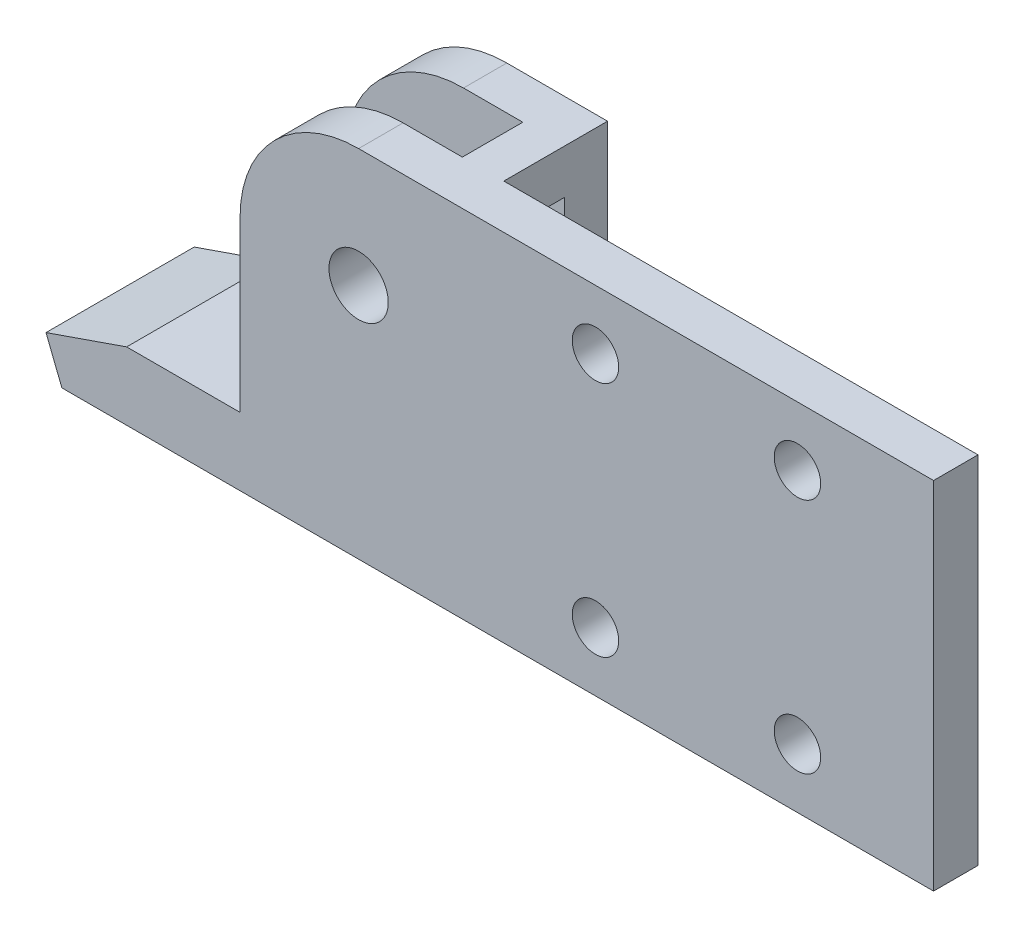
ISO-10303-21;
HEADER;
FILE_DESCRIPTION(('STEP AP214'),'2;1');
FILE_NAME('part.step','',(''),(''),'','','');
FILE_SCHEMA(('AUTOMOTIVE_DESIGN { 1 0 10303 214 1 1 1 1 }'));
ENDSEC;
DATA;
#1=APPLICATION_CONTEXT('core data for automotive mechanical design processes');
#2=APPLICATION_PROTOCOL_DEFINITION('international standard','automotive_design',2000,#1);
#3=PRODUCT_CONTEXT('',#1,'mechanical');
#4=PRODUCT('Part','Part','',(#3));
#5=PRODUCT_RELATED_PRODUCT_CATEGORY('part','',(#4));
#6=PRODUCT_DEFINITION_FORMATION('','',#4);
#7=PRODUCT_DEFINITION_CONTEXT('part definition',#1,'design');
#8=PRODUCT_DEFINITION('design','',#6,#7);
#9=PRODUCT_DEFINITION_SHAPE('','',#8);
#10=(LENGTH_UNIT() NAMED_UNIT(*) SI_UNIT(.MILLI.,.METRE.));
#11=(NAMED_UNIT(*) PLANE_ANGLE_UNIT() SI_UNIT($,.RADIAN.));
#12=(NAMED_UNIT(*) SI_UNIT($,.STERADIAN.) SOLID_ANGLE_UNIT());
#13=UNCERTAINTY_MEASURE_WITH_UNIT(LENGTH_MEASURE(1.E-05),#10,'distance_accuracy_value','');
#14=(GEOMETRIC_REPRESENTATION_CONTEXT(3) GLOBAL_UNCERTAINTY_ASSIGNED_CONTEXT((#13)) GLOBAL_UNIT_ASSIGNED_CONTEXT((#10,
#11,#12)) REPRESENTATION_CONTEXT('',''));
#15=CARTESIAN_POINT('',(0.,0.,0.));
#16=DIRECTION('',(0.,0.,1.));
#17=DIRECTION('',(1.,0.,0.));
#18=AXIS2_PLACEMENT_3D('',#15,#16,#17);
#19=CARTESIAN_POINT('',(-36.195000000001,-203.1333598559,4.7625));
#20=DIRECTION('',(0.,0.,-1.));
#21=DIRECTION('',(-1.,0.,0.));
#22=AXIS2_PLACEMENT_3D('',#19,#20,#21);
#23=CYLINDRICAL_SURFACE('',#22,12.7);
#24=CARTESIAN_POINT('',(-36.195000000001,-203.1333598559,-6.477));
#25=DIRECTION('',(0.,0.,-1.));
#26=DIRECTION('',(0.,1.,0.));
#27=AXIS2_PLACEMENT_3D('',#24,#25,#26);
#28=CIRCLE('',#27,12.7);
#29=CARTESIAN_POINT('',(-48.895000000001,-203.1333598559,-6.477));
#30=VERTEX_POINT('',#29);
#31=CARTESIAN_POINT('',(-36.195000000001,-190.4333598559,-6.477));
#32=VERTEX_POINT('',#31);
#33=EDGE_CURVE('E203',#30,#32,#28,.T.);
#34=ORIENTED_EDGE('',*,*,#33,.T.);
#35=DIRECTION('',(0.,0.,-1.));
#36=VECTOR('',#35,1.);
#37=CARTESIAN_POINT('',(-36.195000000001,-190.4333598559,4.7625));
#38=LINE('',#37,#36);
#39=CARTESIAN_POINT('',(-36.195000000001,-190.4333598559,-11.1125));
#40=VERTEX_POINT('',#39);
#41=EDGE_CURVE('E302',#32,#40,#38,.T.);
#42=ORIENTED_EDGE('',*,*,#41,.T.);
#43=CARTESIAN_POINT('',(-36.195000000001,-203.1333598559,-11.1125));
#44=DIRECTION('',(0.,0.,-1.));
#45=DIRECTION('',(-1.,0.,0.));
#46=AXIS2_PLACEMENT_3D('',#43,#44,#45);
#47=CIRCLE('',#46,12.7);
#48=CARTESIAN_POINT('',(-48.895000000001,-203.1333598559,-11.1125));
#49=VERTEX_POINT('',#48);
#50=EDGE_CURVE('E235',#49,#40,#47,.T.);
#51=ORIENTED_EDGE('',*,*,#50,.F.);
#52=DIRECTION('',(0.,0.,-1.));
#53=VECTOR('',#52,1.);
#54=CARTESIAN_POINT('',(-48.895000000001,-203.1333598559,4.7625));
#55=LINE('',#54,#53);
#56=EDGE_CURVE('E297',#30,#49,#55,.T.);
#57=ORIENTED_EDGE('',*,*,#56,.F.);
#58=EDGE_LOOP('',(#34,#42,#51,#57));
#59=FACE_BOUND('',#58,.T.);
#60=ADVANCED_FACE('F42',(#59),#23,.T.);
#61=CARTESIAN_POINT('',(-24.765000000001,-195.1958598559,0.));
#62=DIRECTION('',(0.,1.,0.));
#63=DIRECTION('',(-1.,0.,0.));
#64=AXIS2_PLACEMENT_3D('',#61,#62,#63);
#65=PLANE('',#64);
#66=DIRECTION('',(0.,0.,-1.));
#67=VECTOR('',#66,1.);
#68=CARTESIAN_POINT('',(-29.845000000001,-195.1958598559,0.));
#69=LINE('',#68,#67);
#70=CARTESIAN_POINT('',(-29.845000000001,-195.1958598559,0.));
#71=VERTEX_POINT('',#70);
#72=CARTESIAN_POINT('',(-29.845000000001,-195.1958598559,-6.477));
#73=VERTEX_POINT('',#72);
#74=EDGE_CURVE('E161',#71,#73,#69,.T.);
#75=ORIENTED_EDGE('',*,*,#74,.T.);
#76=DIRECTION('',(-1.,0.,0.));
#77=VECTOR('',#76,1.);
#78=CARTESIAN_POINT('',(-24.765000000001,-195.1958598559,-6.477));
#79=LINE('',#78,#77);
#80=CARTESIAN_POINT('',(-25.4000000000009,-195.1958598559,-6.477));
#81=VERTEX_POINT('',#80);
#82=EDGE_CURVE('E186',#81,#73,#79,.T.);
#83=ORIENTED_EDGE('',*,*,#82,.F.);
#84=DIRECTION('',(0.,0.,-1.));
#85=VECTOR('',#84,1.);
#86=CARTESIAN_POINT('',(-25.4000000000009,-195.1958598559,-11.1125));
#87=LINE('',#86,#85);
#88=CARTESIAN_POINT('',(-25.4000000000009,-195.1958598559,0.));
#89=VERTEX_POINT('',#88);
#90=EDGE_CURVE('E11',#89,#81,#87,.T.);
#91=ORIENTED_EDGE('',*,*,#90,.F.);
#92=DIRECTION('',(-1.,0.,0.));
#93=VECTOR('',#92,1.);
#94=CARTESIAN_POINT('',(-24.765000000001,-195.1958598559,0.));
#95=LINE('',#94,#93);
#96=EDGE_CURVE('E177',#89,#71,#95,.T.);
#97=ORIENTED_EDGE('',*,*,#96,.T.);
#98=EDGE_LOOP('',(#75,#83,#91,#97));
#99=FACE_BOUND('',#98,.T.);
#100=ADVANCED_FACE('F184',(#99),#65,.F.);
#101=CARTESIAN_POINT('',(-36.195000000001,-203.1333598559,0.));
#102=DIRECTION('',(0.,0.,1.));
#103=DIRECTION('',(1.,0.,0.));
#104=AXIS2_PLACEMENT_3D('',#101,#102,#103);
#105=PLANE('',#104);
#106=CARTESIAN_POINT('',(-10.8204,-196.7833598559,0.));
#107=DIRECTION('',(0.,0.,1.));
#108=DIRECTION('',(1.,0.,0.));
#109=AXIS2_PLACEMENT_3D('',#106,#107,#108);
#110=CIRCLE('',#109,2.4892);
#111=CARTESIAN_POINT('',(-8.3312,-196.7833598559,0.));
#112=VERTEX_POINT('',#111);
#113=EDGE_CURVE('E386',#112,#112,#110,.T.);
#114=ORIENTED_EDGE('',*,*,#113,.T.);
#115=EDGE_LOOP('',(#114));
#116=FACE_BOUND('',#115,.T.);
#117=CARTESIAN_POINT('',(-10.8204,-222.1833598559,0.));
#118=DIRECTION('',(0.,0.,1.));
#119=DIRECTION('',(1.,0.,0.));
#120=AXIS2_PLACEMENT_3D('',#117,#118,#119);
#121=CIRCLE('',#120,2.4892);
#122=CARTESIAN_POINT('',(-8.3312,-222.1833598559,0.));
#123=VERTEX_POINT('',#122);
#124=EDGE_CURVE('E378',#123,#123,#121,.T.);
#125=ORIENTED_EDGE('',*,*,#124,.T.);
#126=EDGE_LOOP('',(#125));
#127=FACE_BOUND('',#126,.T.);
#128=CARTESIAN_POINT('',(10.8204,-222.1833598559,0.));
#129=DIRECTION('',(0.,0.,1.));
#130=DIRECTION('',(1.,0.,0.));
#131=AXIS2_PLACEMENT_3D('',#128,#129,#130);
#132=CIRCLE('',#131,2.4892);
#133=CARTESIAN_POINT('',(13.3096,-222.1833598559,0.));
#134=VERTEX_POINT('',#133);
#135=EDGE_CURVE('E370',#134,#134,#132,.T.);
#136=ORIENTED_EDGE('',*,*,#135,.T.);
#137=EDGE_LOOP('',(#136));
#138=FACE_BOUND('',#137,.T.);
#139=CARTESIAN_POINT('',(10.8204,-196.7833598559,0.));
#140=DIRECTION('',(0.,0.,1.));
#141=DIRECTION('',(1.,0.,0.));
#142=AXIS2_PLACEMENT_3D('',#139,#140,#141);
#143=CIRCLE('',#142,2.4892);
#144=CARTESIAN_POINT('',(13.3096,-196.7833598559,0.));
#145=VERTEX_POINT('',#144);
#146=EDGE_CURVE('E362',#145,#145,#143,.T.);
#147=ORIENTED_EDGE('',*,*,#146,.T.);
#148=EDGE_LOOP('',(#147));
#149=FACE_BOUND('',#148,.T.);
#150=ORIENTED_EDGE('',*,*,#96,.F.);
#151=DIRECTION('',(0.,-1.,0.));
#152=VECTOR('',#151,1.);
#153=CARTESIAN_POINT('',(-25.4000000000009,-190.4333598559,0.));
#154=LINE('',#153,#152);
#155=CARTESIAN_POINT('',(-25.4000000000009,-190.4333598559,0.));
#156=VERTEX_POINT('',#155);
#157=EDGE_CURVE('E212',#156,#89,#154,.T.);
#158=ORIENTED_EDGE('',*,*,#157,.F.);
#159=DIRECTION('',(-1.,0.,0.));
#160=VECTOR('',#159,1.);
#161=CARTESIAN_POINT('',(-36.195000000001,-190.4333598559,0.));
#162=LINE('',#161,#160);
#163=CARTESIAN_POINT('',(25.3999999999991,-190.4333598559,0.));
#164=VERTEX_POINT('',#163);
#165=EDGE_CURVE('E262',#164,#156,#162,.T.);
#166=ORIENTED_EDGE('',*,*,#165,.F.);
#167=DIRECTION('',(0.,1.,0.));
#168=VECTOR('',#167,1.);
#169=CARTESIAN_POINT('',(25.3999999999991,-190.4333598559,0.));
#170=LINE('',#169,#168);
#171=CARTESIAN_POINT('',(25.3999999999991,-228.533359855901,0.));
#172=VERTEX_POINT('',#171);
#173=EDGE_CURVE('E286',#172,#164,#170,.T.);
#174=ORIENTED_EDGE('',*,*,#173,.F.);
#175=DIRECTION('',(1.,0.,0.));
#176=VECTOR('',#175,1.);
#177=CARTESIAN_POINT('',(25.3999999999991,-228.533359855901,0.));
#178=LINE('',#177,#176);
#179=CARTESIAN_POINT('',(-25.4000000000009,-228.533359855901,0.));
#180=VERTEX_POINT('',#179);
#181=EDGE_CURVE('E253',#180,#172,#178,.T.);
#182=ORIENTED_EDGE('',*,*,#181,.F.);
#183=CARTESIAN_POINT('',(-25.4000000000009,-217.052510473162,0.));
#184=VERTEX_POINT('',#183);
#185=EDGE_CURVE('E206',#184,#180,#154,.T.);
#186=ORIENTED_EDGE('',*,*,#185,.F.);
#187=DIRECTION('',(-1.,0.,0.));
#188=VECTOR('',#187,1.);
#189=CARTESIAN_POINT('',(-24.765000000001,-217.052510473162,0.));
#190=LINE('',#189,#188);
#191=CARTESIAN_POINT('',(-48.895000000001,-217.052510473162,0.));
#192=VERTEX_POINT('',#191);
#193=EDGE_CURVE('E187',#184,#192,#190,.T.);
#194=ORIENTED_EDGE('',*,*,#193,.T.);
#195=DIRECTION('',(0.,1.,0.));
#196=VECTOR('',#195,1.);
#197=CARTESIAN_POINT('',(-48.895000000001,0.,0.));
#198=LINE('',#197,#196);
#199=CARTESIAN_POINT('',(-48.895000000001,-203.1333598559,0.));
#200=VERTEX_POINT('',#199);
#201=EDGE_CURVE('E198',#192,#200,#198,.T.);
#202=ORIENTED_EDGE('',*,*,#201,.T.);
#203=CARTESIAN_POINT('',(-36.195000000001,-203.1333598559,0.));
#204=DIRECTION('',(0.,0.,1.));
#205=DIRECTION('',(1.,0.,0.));
#206=AXIS2_PLACEMENT_3D('',#203,#204,#205);
#207=CIRCLE('',#206,12.7);
#208=CARTESIAN_POINT('',(-36.195000000001,-190.4333598559,0.));
#209=VERTEX_POINT('',#208);
#210=EDGE_CURVE('E191',#209,#200,#207,.T.);
#211=ORIENTED_EDGE('',*,*,#210,.F.);
#212=DIRECTION('',(-1.,0.,0.));
#213=VECTOR('',#212,1.);
#214=CARTESIAN_POINT('',(-29.845000000001,-190.4333598559,0.));
#215=LINE('',#214,#213);
#216=CARTESIAN_POINT('',(-29.845000000001,-190.4333598559,0.));
#217=VERTEX_POINT('',#216);
#218=EDGE_CURVE('E180',#217,#209,#215,.T.);
#219=ORIENTED_EDGE('',*,*,#218,.F.);
#220=DIRECTION('',(0.,1.,0.));
#221=VECTOR('',#220,1.);
#222=CARTESIAN_POINT('',(-29.845000000001,0.,0.));
#223=LINE('',#222,#221);
#224=EDGE_CURVE('E164',#71,#217,#223,.T.);
#225=ORIENTED_EDGE('',*,*,#224,.F.);
#226=EDGE_LOOP('',(#150,#158,#166,#174,#182,#186,#194,#202,#211,#219,#225));
#227=FACE_BOUND('',#226,.T.);
#228=CARTESIAN_POINT('',(-36.195000000001,-203.1333598559,0.));
#229=DIRECTION('',(0.,0.,1.));
#230=DIRECTION('',(1.,0.,0.));
#231=AXIS2_PLACEMENT_3D('',#228,#229,#230);
#232=CIRCLE('',#231,3.175);
#233=CARTESIAN_POINT('',(-39.370000000001,-203.1333598559,0.));
#234=VERTEX_POINT('',#233);
#235=EDGE_CURVE('E202',#234,#234,#232,.T.);
#236=ORIENTED_EDGE('',*,*,#235,.T.);
#237=EDGE_LOOP('',(#236));
#238=FACE_BOUND('',#237,.T.);
#239=ADVANCED_FACE('F175',(#116,#127,#138,#149,#227,#238),#105,.F.);
#240=CARTESIAN_POINT('',(-36.195000000001,-203.1333598559,4.7625));
#241=DIRECTION('',(0.,0.,1.));
#242=DIRECTION('',(1.,0.,0.));
#243=AXIS2_PLACEMENT_3D('',#240,#241,#242);
#244=PLANE('',#243);
#245=CARTESIAN_POINT('',(-10.8204,-196.7833598559,4.7625));
#246=DIRECTION('',(0.,0.,1.));
#247=DIRECTION('',(1.,0.,0.));
#248=AXIS2_PLACEMENT_3D('',#245,#246,#247);
#249=CIRCLE('',#248,2.4892);
#250=CARTESIAN_POINT('',(-8.3312,-196.7833598559,4.7625));
#251=VERTEX_POINT('',#250);
#252=EDGE_CURVE('E390',#251,#251,#249,.T.);
#253=ORIENTED_EDGE('',*,*,#252,.F.);
#254=EDGE_LOOP('',(#253));
#255=FACE_BOUND('',#254,.T.);
#256=CARTESIAN_POINT('',(-10.8204,-222.1833598559,4.7625));
#257=DIRECTION('',(0.,0.,1.));
#258=DIRECTION('',(1.,0.,0.));
#259=AXIS2_PLACEMENT_3D('',#256,#257,#258);
#260=CIRCLE('',#259,2.4892);
#261=CARTESIAN_POINT('',(-8.3312,-222.1833598559,4.7625));
#262=VERTEX_POINT('',#261);
#263=EDGE_CURVE('E382',#262,#262,#260,.T.);
#264=ORIENTED_EDGE('',*,*,#263,.F.);
#265=EDGE_LOOP('',(#264));
#266=FACE_BOUND('',#265,.T.);
#267=CARTESIAN_POINT('',(10.8204,-222.1833598559,4.7625));
#268=DIRECTION('',(0.,0.,1.));
#269=DIRECTION('',(1.,0.,0.));
#270=AXIS2_PLACEMENT_3D('',#267,#268,#269);
#271=CIRCLE('',#270,2.4892);
#272=CARTESIAN_POINT('',(13.3096,-222.1833598559,4.7625));
#273=VERTEX_POINT('',#272);
#274=EDGE_CURVE('E374',#273,#273,#271,.T.);
#275=ORIENTED_EDGE('',*,*,#274,.F.);
#276=EDGE_LOOP('',(#275));
#277=FACE_BOUND('',#276,.T.);
#278=CARTESIAN_POINT('',(10.8204,-196.7833598559,4.7625));
#279=DIRECTION('',(0.,0.,1.));
#280=DIRECTION('',(1.,0.,0.));
#281=AXIS2_PLACEMENT_3D('',#278,#279,#280);
#282=CIRCLE('',#281,2.4892);
#283=CARTESIAN_POINT('',(13.3096,-196.7833598559,4.7625));
#284=VERTEX_POINT('',#283);
#285=EDGE_CURVE('E366',#284,#284,#282,.T.);
#286=ORIENTED_EDGE('',*,*,#285,.F.);
#287=EDGE_LOOP('',(#286));
#288=FACE_BOUND('',#287,.T.);
#289=DIRECTION('',(-0.944948295670195,-0.327219679282884,0.));
#290=VECTOR('',#289,1.);
#291=CARTESIAN_POINT('',(-69.6868563657894,-224.252380141043,4.7625));
#292=LINE('',#291,#290);
#293=CARTESIAN_POINT('',(-61.0470257996289,-221.260552334303,4.7625));
#294=VERTEX_POINT('',#293);
#295=CARTESIAN_POINT('',(-69.6868563657894,-224.252380141043,4.7625));
#296=VERTEX_POINT('',#295);
#297=EDGE_CURVE('E257',#294,#296,#292,.T.);
#298=ORIENTED_EDGE('',*,*,#297,.T.);
#299=DIRECTION('',(0.369195948458416,-0.929351575907573,0.));
#300=VECTOR('',#299,1.);
#301=CARTESIAN_POINT('',(-67.9861863425909,-228.533359855901,4.7625));
#302=LINE('',#301,#300);
#303=CARTESIAN_POINT('',(-67.9861863425909,-228.533359855901,4.7625));
#304=VERTEX_POINT('',#303);
#305=EDGE_CURVE('E261',#296,#304,#302,.T.);
#306=ORIENTED_EDGE('',*,*,#305,.T.);
#307=DIRECTION('',(1.,0.,0.));
#308=VECTOR('',#307,1.);
#309=CARTESIAN_POINT('',(25.3999999999991,-228.533359855901,4.7625));
#310=LINE('',#309,#308);
#311=CARTESIAN_POINT('',(25.3999999999991,-228.533359855901,4.7625));
#312=VERTEX_POINT('',#311);
#313=EDGE_CURVE('E265',#304,#312,#310,.T.);
#314=ORIENTED_EDGE('',*,*,#313,.T.);
#315=DIRECTION('',(0.,1.,0.));
#316=VECTOR('',#315,1.);
#317=CARTESIAN_POINT('',(25.3999999999991,-190.4333598559,4.7625));
#318=LINE('',#317,#316);
#319=CARTESIAN_POINT('',(25.3999999999991,-190.4333598559,4.7625));
#320=VERTEX_POINT('',#319);
#321=EDGE_CURVE('E268',#312,#320,#318,.T.);
#322=ORIENTED_EDGE('',*,*,#321,.T.);
#323=DIRECTION('',(-1.,0.,0.));
#324=VECTOR('',#323,1.);
#325=CARTESIAN_POINT('',(-36.195000000001,-190.4333598559,4.7625));
#326=LINE('',#325,#324);
#327=CARTESIAN_POINT('',(-36.195000000001,-190.4333598559,4.7625));
#328=VERTEX_POINT('',#327);
#329=EDGE_CURVE('E271',#320,#328,#326,.T.);
#330=ORIENTED_EDGE('',*,*,#329,.T.);
#331=CARTESIAN_POINT('',(-36.195000000001,-203.1333598559,4.7625));
#332=DIRECTION('',(0.,0.,1.));
#333=DIRECTION('',(1.,0.,0.));
#334=AXIS2_PLACEMENT_3D('',#331,#332,#333);
#335=CIRCLE('',#334,12.7);
#336=CARTESIAN_POINT('',(-48.895000000001,-203.1333598559,4.7625));
#337=VERTEX_POINT('',#336);
#338=EDGE_CURVE('E274',#328,#337,#335,.T.);
#339=ORIENTED_EDGE('',*,*,#338,.T.);
#340=DIRECTION('',(0.,-1.,0.));
#341=VECTOR('',#340,1.);
#342=CARTESIAN_POINT('',(-48.895000000001,-221.260552334303,4.7625));
#343=LINE('',#342,#341);
#344=CARTESIAN_POINT('',(-48.895000000001,-221.260552334303,4.7625));
#345=VERTEX_POINT('',#344);
#346=EDGE_CURVE('E277',#337,#345,#343,.T.);
#347=ORIENTED_EDGE('',*,*,#346,.T.);
#348=DIRECTION('',(-1.,0.,0.));
#349=VECTOR('',#348,1.);
#350=CARTESIAN_POINT('',(-61.0470257996289,-221.260552334303,4.7625));
#351=LINE('',#350,#349);
#352=EDGE_CURVE('E280',#345,#294,#351,.T.);
#353=ORIENTED_EDGE('',*,*,#352,.T.);
#354=EDGE_LOOP('',(#298,#306,#314,#322,#330,#339,#347,#353));
#355=FACE_BOUND('',#354,.T.);
#356=CARTESIAN_POINT('',(-36.195000000001,-203.1333598559,4.7625));
#357=DIRECTION('',(0.,0.,1.));
#358=DIRECTION('',(1.,0.,0.));
#359=AXIS2_PLACEMENT_3D('',#356,#357,#358);
#360=CIRCLE('',#359,3.175);
#361=CARTESIAN_POINT('',(-39.370000000001,-203.1333598559,4.7625));
#362=VERTEX_POINT('',#361);
#363=EDGE_CURVE('E249',#362,#362,#360,.T.);
#364=ORIENTED_EDGE('',*,*,#363,.F.);
#365=EDGE_LOOP('',(#364));
#366=FACE_BOUND('',#365,.T.);
#367=ADVANCED_FACE('F398',(#255,#266,#277,#288,#355,#366),#244,.T.);
#368=CARTESIAN_POINT('',(-69.6868563657894,-224.252380141043,4.7625));
#369=DIRECTION('',(0.327219679282884,-0.944948295670195,0.));
#370=DIRECTION('',(0.944948295670195,0.327219679282884,0.));
#371=AXIS2_PLACEMENT_3D('',#368,#369,#370);
#372=PLANE('',#371);
#373=DIRECTION('',(0.,0.,-1.));
#374=VECTOR('',#373,1.);
#375=CARTESIAN_POINT('',(-61.0470257996289,-221.260552334303,4.7625));
#376=LINE('',#375,#374);
#377=CARTESIAN_POINT('',(-61.0470257996289,-221.260552334303,-11.1125));
#378=VERTEX_POINT('',#377);
#379=EDGE_CURVE('E283',#294,#378,#376,.T.);
#380=ORIENTED_EDGE('',*,*,#379,.T.);
#381=DIRECTION('',(0.944948295670195,0.327219679282884,0.));
#382=VECTOR('',#381,1.);
#383=CARTESIAN_POINT('',(-69.6868563657894,-224.252380141043,-11.1125));
#384=LINE('',#383,#382);
#385=CARTESIAN_POINT('',(-69.6868563657894,-224.252380141043,-11.1125));
#386=VERTEX_POINT('',#385);
#387=EDGE_CURVE('E223',#386,#378,#384,.T.);
#388=ORIENTED_EDGE('',*,*,#387,.F.);
#389=DIRECTION('',(0.,0.,-1.));
#390=VECTOR('',#389,1.);
#391=CARTESIAN_POINT('',(-69.6868563657894,-224.252380141043,4.7625));
#392=LINE('',#391,#390);
#393=EDGE_CURVE('E318',#296,#386,#392,.T.);
#394=ORIENTED_EDGE('',*,*,#393,.F.);
#395=ORIENTED_EDGE('',*,*,#297,.F.);
#396=EDGE_LOOP('',(#380,#388,#394,#395));
#397=FACE_BOUND('',#396,.T.);
#398=ADVANCED_FACE('F44',(#397),#372,.F.);
#399=CARTESIAN_POINT('',(-67.9861863425909,-228.533359855901,4.7625));
#400=DIRECTION('',(0.929351575907574,0.369195948458417,0.));
#401=DIRECTION('',(-0.369195948458417,0.929351575907574,0.));
#402=AXIS2_PLACEMENT_3D('',#399,#400,#401);
#403=PLANE('',#402);
#404=ORIENTED_EDGE('',*,*,#393,.T.);
#405=DIRECTION('',(-0.369195948458416,0.929351575907573,0.));
#406=VECTOR('',#405,1.);
#407=CARTESIAN_POINT('',(-67.9861863425909,-228.533359855901,-11.1125));
#408=LINE('',#407,#406);
#409=CARTESIAN_POINT('',(-67.9861863425909,-228.533359855901,-11.1125));
#410=VERTEX_POINT('',#409);
#411=EDGE_CURVE('E219',#410,#386,#408,.T.);
#412=ORIENTED_EDGE('',*,*,#411,.F.);
#413=DIRECTION('',(0.,0.,-1.));
#414=VECTOR('',#413,1.);
#415=CARTESIAN_POINT('',(-67.9861863425909,-228.533359855901,4.7625));
#416=LINE('',#415,#414);
#417=EDGE_CURVE('E315',#304,#410,#416,.T.);
#418=ORIENTED_EDGE('',*,*,#417,.F.);
#419=ORIENTED_EDGE('',*,*,#305,.F.);
#420=EDGE_LOOP('',(#404,#412,#418,#419));
#421=FACE_BOUND('',#420,.T.);
#422=ADVANCED_FACE('F472',(#421),#403,.F.);
#423=CARTESIAN_POINT('',(25.3999999999991,-228.533359855901,4.7625));
#424=DIRECTION('',(0.,1.,0.));
#425=DIRECTION('',(0.,0.,1.));
#426=AXIS2_PLACEMENT_3D('',#423,#424,#425);
#427=PLANE('',#426);
#428=ORIENTED_EDGE('',*,*,#417,.T.);
#429=DIRECTION('',(-1.,0.,0.));
#430=VECTOR('',#429,1.);
#431=CARTESIAN_POINT('',(-25.4000000000009,-228.533359855901,-11.1125));
#432=LINE('',#431,#430);
#433=CARTESIAN_POINT('',(-25.4000000000009,-228.533359855901,-11.1125));
#434=VERTEX_POINT('',#433);
#435=EDGE_CURVE('E215',#434,#410,#432,.T.);
#436=ORIENTED_EDGE('',*,*,#435,.F.);
#437=DIRECTION('',(0.,0.,1.));
#438=VECTOR('',#437,1.);
#439=CARTESIAN_POINT('',(-25.4000000000009,-228.533359855901,-11.1125));
#440=LINE('',#439,#438);
#441=EDGE_CURVE('E239',#434,#180,#440,.T.);
#442=ORIENTED_EDGE('',*,*,#441,.T.);
#443=ORIENTED_EDGE('',*,*,#181,.T.);
#444=DIRECTION('',(0.,0.,-1.));
#445=VECTOR('',#444,1.);
#446=CARTESIAN_POINT('',(25.3999999999991,-228.533359855901,4.7625));
#447=LINE('',#446,#445);
#448=EDGE_CURVE('E311',#312,#172,#447,.T.);
#449=ORIENTED_EDGE('',*,*,#448,.F.);
#450=ORIENTED_EDGE('',*,*,#313,.F.);
#451=EDGE_LOOP('',(#428,#436,#442,#443,#449,#450));
#452=FACE_BOUND('',#451,.T.);
#453=ADVANCED_FACE('F465',(#452),#427,.F.);
#454=CARTESIAN_POINT('',(25.3999999999991,-190.4333598559,4.7625));
#455=DIRECTION('',(-1.,0.,0.));
#456=DIRECTION('',(0.,-1.,0.));
#457=AXIS2_PLACEMENT_3D('',#454,#455,#456);
#458=PLANE('',#457);
#459=ORIENTED_EDGE('',*,*,#173,.T.);
#460=DIRECTION('',(0.,0.,-1.));
#461=VECTOR('',#460,1.);
#462=CARTESIAN_POINT('',(25.3999999999991,-190.4333598559,4.7625));
#463=LINE('',#462,#461);
#464=EDGE_CURVE('E307',#320,#164,#463,.T.);
#465=ORIENTED_EDGE('',*,*,#464,.F.);
#466=ORIENTED_EDGE('',*,*,#321,.F.);
#467=ORIENTED_EDGE('',*,*,#448,.T.);
#468=EDGE_LOOP('',(#459,#465,#466,#467));
#469=FACE_BOUND('',#468,.T.);
#470=ADVANCED_FACE('F444',(#469),#458,.F.);
#471=CARTESIAN_POINT('',(-36.195000000001,-190.4333598559,4.7625));
#472=DIRECTION('',(0.,-1.,0.));
#473=DIRECTION('',(0.,0.,-1.));
#474=AXIS2_PLACEMENT_3D('',#471,#472,#473);
#475=PLANE('',#474);
#476=ORIENTED_EDGE('',*,*,#41,.F.);
#477=DIRECTION('',(-1.,0.,0.));
#478=VECTOR('',#477,1.);
#479=CARTESIAN_POINT('',(-29.845000000001,-190.4333598559,-6.477));
#480=LINE('',#479,#478);
#481=CARTESIAN_POINT('',(-29.845000000001,-190.4333598559,-6.477));
#482=VERTEX_POINT('',#481);
#483=EDGE_CURVE('E339',#482,#32,#480,.T.);
#484=ORIENTED_EDGE('',*,*,#483,.F.);
#485=DIRECTION('',(0.,0.,-1.));
#486=VECTOR('',#485,1.);
#487=CARTESIAN_POINT('',(-29.845000000001,-190.4333598559,0.));
#488=LINE('',#487,#486);
#489=EDGE_CURVE('E182',#217,#482,#488,.T.);
#490=ORIENTED_EDGE('',*,*,#489,.F.);
#491=ORIENTED_EDGE('',*,*,#218,.T.);
#492=EDGE_CURVE('E303',#328,#209,#38,.T.);
#493=ORIENTED_EDGE('',*,*,#492,.F.);
#494=ORIENTED_EDGE('',*,*,#329,.F.);
#495=ORIENTED_EDGE('',*,*,#464,.T.);
#496=ORIENTED_EDGE('',*,*,#165,.T.);
#497=DIRECTION('',(0.,0.,1.));
#498=VECTOR('',#497,1.);
#499=CARTESIAN_POINT('',(-25.4000000000009,-190.4333598559,-11.1125));
#500=LINE('',#499,#498);
#501=CARTESIAN_POINT('',(-25.4000000000009,-190.4333598559,-11.1125));
#502=VERTEX_POINT('',#501);
#503=EDGE_CURVE('E245',#502,#156,#500,.T.);
#504=ORIENTED_EDGE('',*,*,#503,.F.);
#505=DIRECTION('',(1.,0.,0.));
#506=VECTOR('',#505,1.);
#507=CARTESIAN_POINT('',(-36.195000000001,-190.4333598559,-11.1125));
#508=LINE('',#507,#506);
#509=EDGE_CURVE('E207',#40,#502,#508,.T.);
#510=ORIENTED_EDGE('',*,*,#509,.F.);
#511=EDGE_LOOP('',(#476,#484,#490,#491,#493,#494,#495,#496,#504,#510));
#512=FACE_BOUND('',#511,.T.);
#513=ADVANCED_FACE('F438',(#512),#475,.F.);
#514=ORIENTED_EDGE('',*,*,#492,.T.);
#515=ORIENTED_EDGE('',*,*,#210,.T.);
#516=EDGE_CURVE('E298',#337,#200,#55,.T.);
#517=ORIENTED_EDGE('',*,*,#516,.F.);
#518=ORIENTED_EDGE('',*,*,#338,.F.);
#519=EDGE_LOOP('',(#514,#515,#517,#518));
#520=FACE_BOUND('',#519,.T.);
#521=ADVANCED_FACE('F432',(#520),#23,.T.);
#522=CARTESIAN_POINT('',(-48.895000000001,-221.260552334303,4.7625));
#523=DIRECTION('',(1.,0.,0.));
#524=DIRECTION('',(0.,1.,0.));
#525=AXIS2_PLACEMENT_3D('',#522,#523,#524);
#526=PLANE('',#525);
#527=DIRECTION('',(0.,0.,1.));
#528=VECTOR('',#527,1.);
#529=CARTESIAN_POINT('',(-48.895000000001,-217.052510473162,0.));
#530=LINE('',#529,#528);
#531=CARTESIAN_POINT('',(-48.895000000001,-217.052510473162,-6.477));
#532=VERTEX_POINT('',#531);
#533=EDGE_CURVE('E338',#532,#192,#530,.T.);
#534=ORIENTED_EDGE('',*,*,#533,.F.);
#535=DIRECTION('',(0.,-1.,0.));
#536=VECTOR('',#535,1.);
#537=CARTESIAN_POINT('',(-48.895000000001,0.,-6.47700000000003));
#538=LINE('',#537,#536);
#539=EDGE_CURVE('E332',#30,#532,#538,.T.);
#540=ORIENTED_EDGE('',*,*,#539,.F.);
#541=ORIENTED_EDGE('',*,*,#56,.T.);
#542=DIRECTION('',(0.,1.,0.));
#543=VECTOR('',#542,1.);
#544=CARTESIAN_POINT('',(-48.895000000001,-221.260552334303,-11.1125));
#545=LINE('',#544,#543);
#546=CARTESIAN_POINT('',(-48.895000000001,-221.260552334303,-11.1125));
#547=VERTEX_POINT('',#546);
#548=EDGE_CURVE('E231',#547,#49,#545,.T.);
#549=ORIENTED_EDGE('',*,*,#548,.F.);
#550=DIRECTION('',(0.,0.,-1.));
#551=VECTOR('',#550,1.);
#552=CARTESIAN_POINT('',(-48.895000000001,-221.260552334303,4.7625));
#553=LINE('',#552,#551);
#554=EDGE_CURVE('E294',#345,#547,#553,.T.);
#555=ORIENTED_EDGE('',*,*,#554,.F.);
#556=ORIENTED_EDGE('',*,*,#346,.F.);
#557=ORIENTED_EDGE('',*,*,#516,.T.);
#558=ORIENTED_EDGE('',*,*,#201,.F.);
#559=EDGE_LOOP('',(#534,#540,#541,#549,#555,#556,#557,#558));
#560=FACE_BOUND('',#559,.T.);
#561=ADVANCED_FACE('F342',(#560),#526,.F.);
#562=CARTESIAN_POINT('',(-61.0470257996289,-221.260552334303,4.7625));
#563=DIRECTION('',(0.,-1.,0.));
#564=DIRECTION('',(0.,0.,-1.));
#565=AXIS2_PLACEMENT_3D('',#562,#563,#564);
#566=PLANE('',#565);
#567=ORIENTED_EDGE('',*,*,#554,.T.);
#568=DIRECTION('',(1.,0.,0.));
#569=VECTOR('',#568,1.);
#570=CARTESIAN_POINT('',(-61.0470257996289,-221.260552334303,-11.1125));
#571=LINE('',#570,#569);
#572=EDGE_CURVE('E227',#378,#547,#571,.T.);
#573=ORIENTED_EDGE('',*,*,#572,.F.);
#574=ORIENTED_EDGE('',*,*,#379,.F.);
#575=ORIENTED_EDGE('',*,*,#352,.F.);
#576=EDGE_LOOP('',(#567,#573,#574,#575));
#577=FACE_BOUND('',#576,.T.);
#578=ADVANCED_FACE('F417',(#577),#566,.F.);
#579=CARTESIAN_POINT('',(-36.195000000001,-203.1333598559,4.7625));
#580=DIRECTION('',(0.,0.,-1.));
#581=DIRECTION('',(-1.,0.,0.));
#582=AXIS2_PLACEMENT_3D('',#579,#580,#581);
#583=CYLINDRICAL_SURFACE('',#582,3.175);
#584=CARTESIAN_POINT('',(-39.370000000001,-203.1333598559,4.7625));
#585=CARTESIAN_POINT('',(-39.370000000001,-203.1333598559,4.712890625));
#586=CARTESIAN_POINT('',(-39.370000000001,-203.1333598559,4.66328125));
#587=CARTESIAN_POINT('',(-39.370000000001,-203.1333598559,4.5640625));
#588=CARTESIAN_POINT('',(-39.370000000001,-203.1333598559,4.514453125));
#589=CARTESIAN_POINT('',(-39.370000000001,-203.1333598559,4.415234375));
#590=CARTESIAN_POINT('',(-39.370000000001,-203.1333598559,4.365625));
#591=CARTESIAN_POINT('',(-39.370000000001,-203.1333598559,4.26640625));
#592=CARTESIAN_POINT('',(-39.370000000001,-203.1333598559,4.216796875));
#593=CARTESIAN_POINT('',(-39.370000000001,-203.1333598559,4.117578125));
#594=CARTESIAN_POINT('',(-39.370000000001,-203.1333598559,4.06796875));
#595=CARTESIAN_POINT('',(-39.370000000001,-203.1333598559,3.96875));
#596=CARTESIAN_POINT('',(-39.370000000001,-203.1333598559,3.919140625));
#597=CARTESIAN_POINT('',(-39.370000000001,-203.1333598559,3.819921875));
#598=CARTESIAN_POINT('',(-39.370000000001,-203.1333598559,3.7703125));
#599=CARTESIAN_POINT('',(-39.370000000001,-203.1333598559,3.67109375));
#600=CARTESIAN_POINT('',(-39.370000000001,-203.1333598559,3.621484375));
#601=CARTESIAN_POINT('',(-39.370000000001,-203.1333598559,3.522265625));
#602=CARTESIAN_POINT('',(-39.370000000001,-203.1333598559,3.47265625));
#603=CARTESIAN_POINT('',(-39.370000000001,-203.1333598559,3.3734375));
#604=CARTESIAN_POINT('',(-39.370000000001,-203.1333598559,3.323828125));
#605=CARTESIAN_POINT('',(-39.370000000001,-203.1333598559,3.224609375));
#606=CARTESIAN_POINT('',(-39.370000000001,-203.1333598559,3.175));
#607=CARTESIAN_POINT('',(-39.370000000001,-203.1333598559,3.07578125));
#608=CARTESIAN_POINT('',(-39.370000000001,-203.1333598559,3.026171875));
#609=CARTESIAN_POINT('',(-39.370000000001,-203.1333598559,2.926953125));
#610=CARTESIAN_POINT('',(-39.370000000001,-203.1333598559,2.87734375));
#611=CARTESIAN_POINT('',(-39.370000000001,-203.1333598559,2.778125));
#612=CARTESIAN_POINT('',(-39.370000000001,-203.1333598559,2.728515625));
#613=CARTESIAN_POINT('',(-39.370000000001,-203.1333598559,2.629296875));
#614=CARTESIAN_POINT('',(-39.370000000001,-203.1333598559,2.5796875));
#615=CARTESIAN_POINT('',(-39.370000000001,-203.1333598559,2.48046875));
#616=CARTESIAN_POINT('',(-39.370000000001,-203.1333598559,2.430859375));
#617=CARTESIAN_POINT('',(-39.370000000001,-203.1333598559,2.331640625));
#618=CARTESIAN_POINT('',(-39.370000000001,-203.1333598559,2.28203125));
#619=CARTESIAN_POINT('',(-39.370000000001,-203.1333598559,2.1828125));
#620=CARTESIAN_POINT('',(-39.370000000001,-203.1333598559,2.133203125));
#621=CARTESIAN_POINT('',(-39.370000000001,-203.1333598559,2.033984375));
#622=CARTESIAN_POINT('',(-39.370000000001,-203.1333598559,1.984375));
#623=CARTESIAN_POINT('',(-39.370000000001,-203.1333598559,1.88515625));
#624=CARTESIAN_POINT('',(-39.370000000001,-203.1333598559,1.835546875));
#625=CARTESIAN_POINT('',(-39.370000000001,-203.1333598559,1.736328125));
#626=CARTESIAN_POINT('',(-39.370000000001,-203.1333598559,1.68671875));
#627=CARTESIAN_POINT('',(-39.370000000001,-203.1333598559,1.5875));
#628=CARTESIAN_POINT('',(-39.370000000001,-203.1333598559,1.537890625));
#629=CARTESIAN_POINT('',(-39.370000000001,-203.1333598559,1.438671875));
#630=CARTESIAN_POINT('',(-39.370000000001,-203.1333598559,1.3890625));
#631=CARTESIAN_POINT('',(-39.370000000001,-203.1333598559,1.28984375));
#632=CARTESIAN_POINT('',(-39.370000000001,-203.1333598559,1.240234375));
#633=CARTESIAN_POINT('',(-39.370000000001,-203.1333598559,1.141015625));
#634=CARTESIAN_POINT('',(-39.370000000001,-203.1333598559,1.09140625));
#635=CARTESIAN_POINT('',(-39.370000000001,-203.1333598559,0.9921875));
#636=CARTESIAN_POINT('',(-39.370000000001,-203.1333598559,0.942578125));
#637=CARTESIAN_POINT('',(-39.370000000001,-203.1333598559,0.843359375));
#638=CARTESIAN_POINT('',(-39.370000000001,-203.1333598559,0.79375));
#639=CARTESIAN_POINT('',(-39.370000000001,-203.1333598559,0.69453125));
#640=CARTESIAN_POINT('',(-39.370000000001,-203.1333598559,0.644921875));
#641=CARTESIAN_POINT('',(-39.370000000001,-203.1333598559,0.545703125));
#642=CARTESIAN_POINT('',(-39.370000000001,-203.1333598559,0.49609375));
#643=CARTESIAN_POINT('',(-39.370000000001,-203.1333598559,0.396875));
#644=CARTESIAN_POINT('',(-39.370000000001,-203.1333598559,0.347265625));
#645=CARTESIAN_POINT('',(-39.370000000001,-203.1333598559,0.248046875));
#646=CARTESIAN_POINT('',(-39.370000000001,-203.1333598559,0.1984375));
#647=CARTESIAN_POINT('',(-39.370000000001,-203.1333598559,0.09921875));
#648=CARTESIAN_POINT('',(-39.370000000001,-203.1333598559,0.049609375));
#649=CARTESIAN_POINT('',(-39.370000000001,-203.1333598559,0.));
#650=B_SPLINE_CURVE_WITH_KNOTS('',3,(#584,#585,#586,#587,#588,#589,#590,#591,#592,#593,#594,
#595,#596,#597,#598,#599,#600,#601,#602,#603,#604,#605,#606,#607,#608,#609,#610,#611,#612,#613,
#614,#615,#616,#617,#618,#619,#620,#621,#622,#623,#624,#625,#626,#627,#628,#629,#630,#631,#632,
#633,#634,#635,#636,#637,#638,#639,#640,#641,#642,#643,#644,#645,#646,#647,#648,#649),
.UNSPECIFIED.,.F.,.F.,(4,2,2,2,2,2,2,2,2,2,2,2,2,2,2,2,2,2,2,2,2,2,2,2,2,2,2,2,2,2,2,2,4),(0.,
0.148828124999999,0.297656249999999,0.446484374999999,0.595312499999999,0.744140625,0.89296875,
1.041796875,1.190625,1.339453125,1.48828125,1.637109375,1.7859375,1.934765625,2.08359375,
2.232421875,2.38125,2.530078125,2.67890625,2.827734375,2.9765625,3.125390625,3.27421875,
3.423046875,3.571875,3.720703125,3.86953125,4.018359375,4.1671875,4.316015625,4.46484375,
4.613671875,4.7625),.UNSPECIFIED.);
#651=EDGE_CURVE('BSEAM413',#362,#234,#650,.T.);
#652=ORIENTED_EDGE('',*,*,#363,.T.);
#653=ORIENTED_EDGE('',*,*,#235,.F.);
#654=ORIENTED_EDGE('',*,*,#651,.T.);
#655=ORIENTED_EDGE('',*,*,#651,.F.);
#656=EDGE_LOOP('',(#652,#654,#653,#655));
#657=FACE_BOUND('',#656,.T.);
#658=ADVANCED_FACE('F413',(#657),#583,.F.);
#659=CARTESIAN_POINT('',(-36.195000000001,-203.1333598559,-11.1125));
#660=DIRECTION('',(0.,0.,-1.));
#661=DIRECTION('',(-1.,0.,0.));
#662=AXIS2_PLACEMENT_3D('',#659,#660,#661);
#663=PLANE('',#662);
#664=CARTESIAN_POINT('',(-36.195000000001,-203.1333598559,-11.1125));
#665=DIRECTION('',(0.,0.,1.));
#666=DIRECTION('',(1.,0.,0.));
#667=AXIS2_PLACEMENT_3D('',#664,#665,#666);
#668=CIRCLE('',#667,2.0193);
#669=CARTESIAN_POINT('',(-34.175700000001,-203.1333598559,-11.1125));
#670=VERTEX_POINT('',#669);
#671=EDGE_CURVE('E171',#670,#670,#668,.T.);
#672=ORIENTED_EDGE('',*,*,#671,.T.);
#673=EDGE_LOOP('',(#672));
#674=FACE_BOUND('',#673,.T.);
#675=ORIENTED_EDGE('',*,*,#509,.T.);
#676=DIRECTION('',(0.,-1.,0.));
#677=VECTOR('',#676,1.);
#678=CARTESIAN_POINT('',(-25.4000000000009,-190.4333598559,-11.1125));
#679=LINE('',#678,#677);
#680=EDGE_CURVE('E211',#502,#434,#679,.T.);
#681=ORIENTED_EDGE('',*,*,#680,.T.);
#682=ORIENTED_EDGE('',*,*,#435,.T.);
#683=ORIENTED_EDGE('',*,*,#411,.T.);
#684=ORIENTED_EDGE('',*,*,#387,.T.);
#685=ORIENTED_EDGE('',*,*,#572,.T.);
#686=ORIENTED_EDGE('',*,*,#548,.T.);
#687=ORIENTED_EDGE('',*,*,#50,.T.);
#688=EDGE_LOOP('',(#675,#681,#682,#683,#684,#685,#686,#687));
#689=FACE_BOUND('',#688,.T.);
#690=ADVANCED_FACE('F416',(#674,#689),#663,.T.);
#691=CARTESIAN_POINT('',(-25.4000000000009,-190.4333598559,-11.1125));
#692=DIRECTION('',(-1.,0.,0.));
#693=DIRECTION('',(0.,0.,1.));
#694=AXIS2_PLACEMENT_3D('',#691,#692,#693);
#695=PLANE('',#694);
#696=ORIENTED_EDGE('',*,*,#157,.T.);
#697=ORIENTED_EDGE('',*,*,#90,.T.);
#698=DIRECTION('',(0.,-1.,0.));
#699=VECTOR('',#698,1.);
#700=CARTESIAN_POINT('',(-25.4000000000009,-190.4333598559,-6.477));
#701=LINE('',#700,#699);
#702=CARTESIAN_POINT('',(-25.4000000000009,-217.052510473162,-6.477));
#703=VERTEX_POINT('',#702);
#704=EDGE_CURVE('E51',#81,#703,#701,.T.);
#705=ORIENTED_EDGE('',*,*,#704,.T.);
#706=DIRECTION('',(0.,0.,1.));
#707=VECTOR('',#706,1.);
#708=CARTESIAN_POINT('',(-25.4000000000009,-217.052510473162,-11.1125));
#709=LINE('',#708,#707);
#710=EDGE_CURVE('E321',#703,#184,#709,.T.);
#711=ORIENTED_EDGE('',*,*,#710,.T.);
#712=ORIENTED_EDGE('',*,*,#185,.T.);
#713=ORIENTED_EDGE('',*,*,#441,.F.);
#714=ORIENTED_EDGE('',*,*,#680,.F.);
#715=ORIENTED_EDGE('',*,*,#503,.T.);
#716=EDGE_LOOP('',(#696,#697,#705,#711,#712,#713,#714,#715));
#717=FACE_BOUND('',#716,.T.);
#718=ADVANCED_FACE('F327',(#717),#695,.F.);
#719=CARTESIAN_POINT('',(-24.765000000001,0.,-6.47700000000003));
#720=DIRECTION('',(0.,0.,-1.));
#721=DIRECTION('',(0.,1.,0.));
#722=AXIS2_PLACEMENT_3D('',#719,#720,#721);
#723=PLANE('',#722);
#724=CARTESIAN_POINT('',(-36.195000000001,-203.1333598559,-6.47700000000003));
#725=DIRECTION('',(0.,0.,1.));
#726=DIRECTION('',(1.,0.,0.));
#727=AXIS2_PLACEMENT_3D('',#724,#725,#726);
#728=CIRCLE('',#727,2.0193);
#729=CARTESIAN_POINT('',(-34.175700000001,-203.1333598559,-6.47700000000003));
#730=VERTEX_POINT('',#729);
#731=EDGE_CURVE('E358',#730,#730,#728,.T.);
#732=ORIENTED_EDGE('',*,*,#731,.F.);
#733=EDGE_LOOP('',(#732));
#734=FACE_BOUND('',#733,.T.);
#735=ORIENTED_EDGE('',*,*,#539,.T.);
#736=DIRECTION('',(-1.,0.,0.));
#737=VECTOR('',#736,1.);
#738=CARTESIAN_POINT('',(-24.765000000001,-217.052510473162,-6.477));
#739=LINE('',#738,#737);
#740=EDGE_CURVE('E66',#703,#532,#739,.T.);
#741=ORIENTED_EDGE('',*,*,#740,.F.);
#742=ORIENTED_EDGE('',*,*,#704,.F.);
#743=ORIENTED_EDGE('',*,*,#82,.T.);
#744=DIRECTION('',(0.,-1.,0.));
#745=VECTOR('',#744,1.);
#746=CARTESIAN_POINT('',(-29.845000000001,0.,-6.47700000000003));
#747=LINE('',#746,#745);
#748=EDGE_CURVE('E58',#482,#73,#747,.T.);
#749=ORIENTED_EDGE('',*,*,#748,.F.);
#750=ORIENTED_EDGE('',*,*,#483,.T.);
#751=ORIENTED_EDGE('',*,*,#33,.F.);
#752=EDGE_LOOP('',(#735,#741,#742,#743,#749,#750,#751));
#753=FACE_BOUND('',#752,.T.);
#754=ADVANCED_FACE('F330',(#734,#753),#723,.F.);
#755=CARTESIAN_POINT('',(-24.765000000001,-217.052510473162,0.));
#756=DIRECTION('',(0.,-1.,0.));
#757=DIRECTION('',(1.,0.,0.));
#758=AXIS2_PLACEMENT_3D('',#755,#756,#757);
#759=PLANE('',#758);
#760=ORIENTED_EDGE('',*,*,#740,.T.);
#761=ORIENTED_EDGE('',*,*,#533,.T.);
#762=ORIENTED_EDGE('',*,*,#193,.F.);
#763=ORIENTED_EDGE('',*,*,#710,.F.);
#764=EDGE_LOOP('',(#760,#761,#762,#763));
#765=FACE_BOUND('',#764,.T.);
#766=ADVANCED_FACE('F570',(#765),#759,.F.);
#767=CARTESIAN_POINT('',(-29.845000000001,0.,0.));
#768=DIRECTION('',(-1.,0.,0.));
#769=DIRECTION('',(0.,-1.,0.));
#770=AXIS2_PLACEMENT_3D('',#767,#768,#769);
#771=PLANE('',#770);
#772=ORIENTED_EDGE('',*,*,#74,.F.);
#773=ORIENTED_EDGE('',*,*,#224,.T.);
#774=ORIENTED_EDGE('',*,*,#489,.T.);
#775=ORIENTED_EDGE('',*,*,#748,.T.);
#776=EDGE_LOOP('',(#772,#773,#774,#775));
#777=FACE_BOUND('',#776,.T.);
#778=ADVANCED_FACE('F163',(#777),#771,.T.);
#779=CARTESIAN_POINT('',(-36.195000000001,-203.1333598559,-6.47700000000003));
#780=DIRECTION('',(0.,0.,1.));
#781=DIRECTION('',(1.,0.,0.));
#782=AXIS2_PLACEMENT_3D('',#779,#780,#781);
#783=CYLINDRICAL_SURFACE('',#782,2.0193);
#784=ORIENTED_EDGE('',*,*,#671,.F.);
#785=EDGE_LOOP('',(#784));
#786=FACE_BOUND('',#785,.T.);
#787=ORIENTED_EDGE('',*,*,#731,.T.);
#788=EDGE_LOOP('',(#787));
#789=FACE_BOUND('',#788,.T.);
#790=ADVANCED_FACE('F517',(#786,#789),#783,.F.);
#791=CARTESIAN_POINT('',(10.8204,-196.7833598559,4.7625));
#792=DIRECTION('',(0.,0.,1.));
#793=DIRECTION('',(1.,0.,0.));
#794=AXIS2_PLACEMENT_3D('',#791,#792,#793);
#795=CYLINDRICAL_SURFACE('',#794,2.4892);
#796=ORIENTED_EDGE('',*,*,#285,.T.);
#797=EDGE_LOOP('',(#796));
#798=FACE_BOUND('',#797,.T.);
#799=ORIENTED_EDGE('',*,*,#146,.F.);
#800=EDGE_LOOP('',(#799));
#801=FACE_BOUND('',#800,.T.);
#802=ADVANCED_FACE('F511',(#798,#801),#795,.F.);
#803=CARTESIAN_POINT('',(10.8204,-222.1833598559,4.7625));
#804=DIRECTION('',(0.,0.,1.));
#805=DIRECTION('',(1.,0.,0.));
#806=AXIS2_PLACEMENT_3D('',#803,#804,#805);
#807=CYLINDRICAL_SURFACE('',#806,2.4892);
#808=ORIENTED_EDGE('',*,*,#274,.T.);
#809=EDGE_LOOP('',(#808));
#810=FACE_BOUND('',#809,.T.);
#811=ORIENTED_EDGE('',*,*,#135,.F.);
#812=EDGE_LOOP('',(#811));
#813=FACE_BOUND('',#812,.T.);
#814=ADVANCED_FACE('F516',(#810,#813),#807,.F.);
#815=CARTESIAN_POINT('',(-10.8204,-222.1833598559,4.7625));
#816=DIRECTION('',(0.,0.,1.));
#817=DIRECTION('',(1.,0.,0.));
#818=AXIS2_PLACEMENT_3D('',#815,#816,#817);
#819=CYLINDRICAL_SURFACE('',#818,2.4892);
#820=ORIENTED_EDGE('',*,*,#263,.T.);
#821=EDGE_LOOP('',(#820));
#822=FACE_BOUND('',#821,.T.);
#823=ORIENTED_EDGE('',*,*,#124,.F.);
#824=EDGE_LOOP('',(#823));
#825=FACE_BOUND('',#824,.T.);
#826=ADVANCED_FACE('F530',(#822,#825),#819,.F.);
#827=CARTESIAN_POINT('',(-10.8204,-196.7833598559,4.7625));
#828=DIRECTION('',(0.,0.,1.));
#829=DIRECTION('',(1.,0.,0.));
#830=AXIS2_PLACEMENT_3D('',#827,#828,#829);
#831=CYLINDRICAL_SURFACE('',#830,2.4892);
#832=ORIENTED_EDGE('',*,*,#252,.T.);
#833=EDGE_LOOP('',(#832));
#834=FACE_BOUND('',#833,.T.);
#835=ORIENTED_EDGE('',*,*,#113,.F.);
#836=EDGE_LOOP('',(#835));
#837=FACE_BOUND('',#836,.T.);
#838=ADVANCED_FACE('F395',(#834,#837),#831,.F.);
#839=CLOSED_SHELL('',(#60,#100,#239,#367,#398,#422,#453,#470,#513,#521,#561,#578,#658,#690,#718,
#754,#766,#778,#790,#802,#814,#826,#838));
#840=MANIFOLD_SOLID_BREP('B2',#839);
#841=ADVANCED_BREP_SHAPE_REPRESENTATION('',(#18,#840),#14);
#842=SHAPE_DEFINITION_REPRESENTATION(#9,#841);
ENDSEC;
END-ISO-10303-21;
